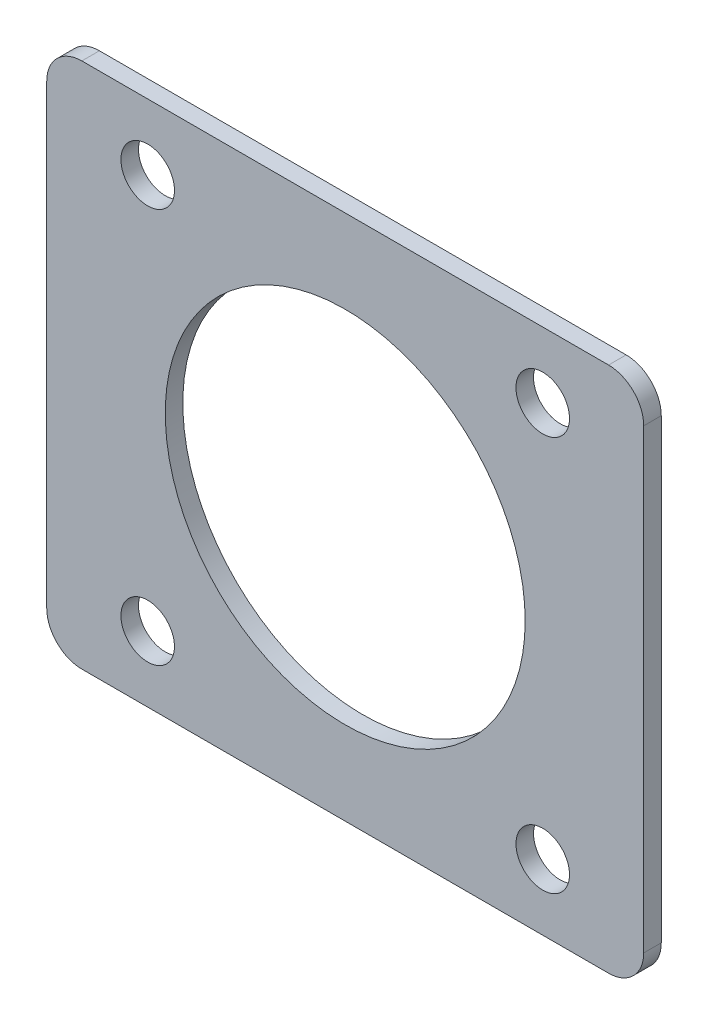
ISO-10303-21;
HEADER;
FILE_DESCRIPTION(('STEP AP214'),'2;1');
FILE_NAME('part.step','',(''),(''),'','','');
FILE_SCHEMA(('AUTOMOTIVE_DESIGN { 1 0 10303 214 1 1 1 1 }'));
ENDSEC;
DATA;
#1=APPLICATION_CONTEXT('core data for automotive mechanical design processes');
#2=APPLICATION_PROTOCOL_DEFINITION('international standard','automotive_design',2000,#1);
#3=PRODUCT_CONTEXT('',#1,'mechanical');
#4=PRODUCT('Part','Part','',(#3));
#5=PRODUCT_RELATED_PRODUCT_CATEGORY('part','',(#4));
#6=PRODUCT_DEFINITION_FORMATION('','',#4);
#7=PRODUCT_DEFINITION_CONTEXT('part definition',#1,'design');
#8=PRODUCT_DEFINITION('design','',#6,#7);
#9=PRODUCT_DEFINITION_SHAPE('','',#8);
#10=(LENGTH_UNIT() NAMED_UNIT(*) SI_UNIT(.MILLI.,.METRE.));
#11=(NAMED_UNIT(*) PLANE_ANGLE_UNIT() SI_UNIT($,.RADIAN.));
#12=(NAMED_UNIT(*) SI_UNIT($,.STERADIAN.) SOLID_ANGLE_UNIT());
#13=UNCERTAINTY_MEASURE_WITH_UNIT(LENGTH_MEASURE(1.E-05),#10,'distance_accuracy_value','');
#14=(GEOMETRIC_REPRESENTATION_CONTEXT(3) GLOBAL_UNCERTAINTY_ASSIGNED_CONTEXT((#13)) GLOBAL_UNIT_ASSIGNED_CONTEXT((#10,
#11,#12)) REPRESENTATION_CONTEXT('',''));
#15=CARTESIAN_POINT('',(0.,0.,0.));
#16=DIRECTION('',(0.,0.,1.));
#17=DIRECTION('',(1.,0.,0.));
#18=AXIS2_PLACEMENT_3D('',#15,#16,#17);
#19=CARTESIAN_POINT('',(30.,26.,2.));
#20=DIRECTION('',(0.,0.,1.));
#21=DIRECTION('',(1.,0.,0.));
#22=AXIS2_PLACEMENT_3D('',#19,#20,#21);
#23=PLANE('',#22);
#24=CARTESIAN_POINT('',(22.5,22.5,2.));
#25=DIRECTION('',(0.,0.,1.));
#26=DIRECTION('',(-1.,0.,0.));
#27=AXIS2_PLACEMENT_3D('',#24,#25,#26);
#28=CIRCLE('',#27,3.05);
#29=CARTESIAN_POINT('',(19.45,22.5,2.));
#30=VERTEX_POINT('',#29);
#31=EDGE_CURVE('E185',#30,#30,#28,.T.);
#32=ORIENTED_EDGE('',*,*,#31,.F.);
#33=EDGE_LOOP('',(#32));
#34=FACE_BOUND('',#33,.T.);
#35=CARTESIAN_POINT('',(-22.5,-22.5,2.));
#36=DIRECTION('',(0.,0.,1.));
#37=DIRECTION('',(-1.,0.,0.));
#38=AXIS2_PLACEMENT_3D('',#35,#36,#37);
#39=CIRCLE('',#38,3.05);
#40=CARTESIAN_POINT('',(-25.55,-22.5,2.));
#41=VERTEX_POINT('',#40);
#42=EDGE_CURVE('E186',#41,#41,#39,.T.);
#43=ORIENTED_EDGE('',*,*,#42,.F.);
#44=EDGE_LOOP('',(#43));
#45=FACE_BOUND('',#44,.T.);
#46=CARTESIAN_POINT('',(30.,26.,2.));
#47=DIRECTION('',(0.,0.,1.));
#48=DIRECTION('',(1.,0.,0.));
#49=AXIS2_PLACEMENT_3D('',#46,#47,#48);
#50=CIRCLE('',#49,4.);
#51=CARTESIAN_POINT('',(34.,26.,2.));
#52=VERTEX_POINT('',#51);
#53=CARTESIAN_POINT('',(30.,30.,2.));
#54=VERTEX_POINT('',#53);
#55=EDGE_CURVE('E199',#52,#54,#50,.T.);
#56=ORIENTED_EDGE('',*,*,#55,.T.);
#57=DIRECTION('',(-1.,0.,0.));
#58=VECTOR('',#57,1.);
#59=CARTESIAN_POINT('',(-30.,30.,2.));
#60=LINE('',#59,#58);
#61=CARTESIAN_POINT('',(-30.,30.,2.));
#62=VERTEX_POINT('',#61);
#63=EDGE_CURVE('E104',#54,#62,#60,.T.);
#64=ORIENTED_EDGE('',*,*,#63,.T.);
#65=CARTESIAN_POINT('',(-30.,26.,2.));
#66=DIRECTION('',(0.,0.,1.));
#67=DIRECTION('',(1.,0.,0.));
#68=AXIS2_PLACEMENT_3D('',#65,#66,#67);
#69=CIRCLE('',#68,4.);
#70=CARTESIAN_POINT('',(-34.,26.,2.));
#71=VERTEX_POINT('',#70);
#72=EDGE_CURVE('E210',#62,#71,#69,.T.);
#73=ORIENTED_EDGE('',*,*,#72,.T.);
#74=DIRECTION('',(0.,-1.,0.));
#75=VECTOR('',#74,1.);
#76=CARTESIAN_POINT('',(-34.,26.,2.));
#77=LINE('',#76,#75);
#78=CARTESIAN_POINT('',(-34.,-26.,2.));
#79=VERTEX_POINT('',#78);
#80=EDGE_CURVE('E213',#71,#79,#77,.T.);
#81=ORIENTED_EDGE('',*,*,#80,.T.);
#82=CARTESIAN_POINT('',(-30.,-26.,2.));
#83=DIRECTION('',(0.,0.,1.));
#84=DIRECTION('',(1.,0.,0.));
#85=AXIS2_PLACEMENT_3D('',#82,#83,#84);
#86=CIRCLE('',#85,4.);
#87=CARTESIAN_POINT('',(-30.,-30.,2.));
#88=VERTEX_POINT('',#87);
#89=EDGE_CURVE('E123',#79,#88,#86,.T.);
#90=ORIENTED_EDGE('',*,*,#89,.T.);
#91=DIRECTION('',(1.,0.,0.));
#92=VECTOR('',#91,1.);
#93=CARTESIAN_POINT('',(-30.,-30.,2.));
#94=LINE('',#93,#92);
#95=CARTESIAN_POINT('',(30.,-30.,2.));
#96=VERTEX_POINT('',#95);
#97=EDGE_CURVE('E117',#88,#96,#94,.T.);
#98=ORIENTED_EDGE('',*,*,#97,.T.);
#99=CARTESIAN_POINT('',(30.,-26.,2.));
#100=DIRECTION('',(0.,0.,1.));
#101=DIRECTION('',(1.,0.,0.));
#102=AXIS2_PLACEMENT_3D('',#99,#100,#101);
#103=CIRCLE('',#102,4.);
#104=CARTESIAN_POINT('',(34.,-26.,2.));
#105=VERTEX_POINT('',#104);
#106=EDGE_CURVE('E121',#96,#105,#103,.T.);
#107=ORIENTED_EDGE('',*,*,#106,.T.);
#108=DIRECTION('',(0.,1.,0.));
#109=VECTOR('',#108,1.);
#110=CARTESIAN_POINT('',(34.,26.,2.));
#111=LINE('',#110,#109);
#112=EDGE_CURVE('E61',#105,#52,#111,.T.);
#113=ORIENTED_EDGE('',*,*,#112,.T.);
#114=EDGE_LOOP('',(#56,#64,#73,#81,#90,#98,#107,#113));
#115=FACE_BOUND('',#114,.T.);
#116=CARTESIAN_POINT('',(22.5,-22.5,2.));
#117=DIRECTION('',(0.,0.,1.));
#118=DIRECTION('',(1.,0.,0.));
#119=AXIS2_PLACEMENT_3D('',#116,#117,#118);
#120=CIRCLE('',#119,3.05);
#121=CARTESIAN_POINT('',(25.55,-22.5,2.));
#122=VERTEX_POINT('',#121);
#123=EDGE_CURVE('E158',#122,#122,#120,.T.);
#124=ORIENTED_EDGE('',*,*,#123,.F.);
#125=EDGE_LOOP('',(#124));
#126=FACE_BOUND('',#125,.T.);
#127=CARTESIAN_POINT('',(-22.5,22.5,2.));
#128=DIRECTION('',(0.,0.,1.));
#129=DIRECTION('',(1.,0.,0.));
#130=AXIS2_PLACEMENT_3D('',#127,#128,#129);
#131=CIRCLE('',#130,3.05);
#132=CARTESIAN_POINT('',(-19.45,22.5,2.));
#133=VERTEX_POINT('',#132);
#134=EDGE_CURVE('E174',#133,#133,#131,.T.);
#135=ORIENTED_EDGE('',*,*,#134,.F.);
#136=EDGE_LOOP('',(#135));
#137=FACE_BOUND('',#136,.T.);
#138=CARTESIAN_POINT('',(0.,0.,2.));
#139=DIRECTION('',(0.,0.,1.));
#140=DIRECTION('',(1.,0.,0.));
#141=AXIS2_PLACEMENT_3D('',#138,#139,#140);
#142=CIRCLE('',#141,20.5);
#143=CARTESIAN_POINT('',(20.5,0.,2.));
#144=VERTEX_POINT('',#143);
#145=EDGE_CURVE('E270',#144,#144,#142,.T.);
#146=ORIENTED_EDGE('',*,*,#145,.F.);
#147=EDGE_LOOP('',(#146));
#148=FACE_BOUND('',#147,.T.);
#149=ADVANCED_FACE('F44',(#34,#45,#115,#126,#137,#148),#23,.T.);
#150=CARTESIAN_POINT('',(30.,26.,0.));
#151=DIRECTION('',(0.,0.,1.));
#152=DIRECTION('',(1.,0.,0.));
#153=AXIS2_PLACEMENT_3D('',#150,#151,#152);
#154=PLANE('',#153);
#155=CARTESIAN_POINT('',(30.,26.,0.));
#156=DIRECTION('',(0.,0.,1.));
#157=DIRECTION('',(1.,0.,0.));
#158=AXIS2_PLACEMENT_3D('',#155,#156,#157);
#159=CIRCLE('',#158,4.);
#160=CARTESIAN_POINT('',(34.,26.,0.));
#161=VERTEX_POINT('',#160);
#162=CARTESIAN_POINT('',(30.,30.,0.));
#163=VERTEX_POINT('',#162);
#164=EDGE_CURVE('E164',#161,#163,#159,.T.);
#165=ORIENTED_EDGE('',*,*,#164,.F.);
#166=DIRECTION('',(0.,1.,0.));
#167=VECTOR('',#166,1.);
#168=CARTESIAN_POINT('',(34.,26.,0.));
#169=LINE('',#168,#167);
#170=CARTESIAN_POINT('',(34.,-26.,0.));
#171=VERTEX_POINT('',#170);
#172=EDGE_CURVE('E96',#171,#161,#169,.T.);
#173=ORIENTED_EDGE('',*,*,#172,.F.);
#174=CARTESIAN_POINT('',(30.,-26.,0.));
#175=DIRECTION('',(0.,0.,1.));
#176=DIRECTION('',(1.,0.,0.));
#177=AXIS2_PLACEMENT_3D('',#174,#175,#176);
#178=CIRCLE('',#177,4.);
#179=CARTESIAN_POINT('',(30.,-30.,0.));
#180=VERTEX_POINT('',#179);
#181=EDGE_CURVE('E90',#180,#171,#178,.T.);
#182=ORIENTED_EDGE('',*,*,#181,.F.);
#183=DIRECTION('',(1.,0.,0.));
#184=VECTOR('',#183,1.);
#185=CARTESIAN_POINT('',(-30.,-30.,0.));
#186=LINE('',#185,#184);
#187=CARTESIAN_POINT('',(-30.,-30.,0.));
#188=VERTEX_POINT('',#187);
#189=EDGE_CURVE('E132',#188,#180,#186,.T.);
#190=ORIENTED_EDGE('',*,*,#189,.F.);
#191=CARTESIAN_POINT('',(-30.,-26.,0.));
#192=DIRECTION('',(0.,0.,1.));
#193=DIRECTION('',(1.,0.,0.));
#194=AXIS2_PLACEMENT_3D('',#191,#192,#193);
#195=CIRCLE('',#194,4.);
#196=CARTESIAN_POINT('',(-34.,-26.,0.));
#197=VERTEX_POINT('',#196);
#198=EDGE_CURVE('E237',#197,#188,#195,.T.);
#199=ORIENTED_EDGE('',*,*,#198,.F.);
#200=DIRECTION('',(0.,-1.,0.));
#201=VECTOR('',#200,1.);
#202=CARTESIAN_POINT('',(-34.,26.,0.));
#203=LINE('',#202,#201);
#204=CARTESIAN_POINT('',(-34.,26.,0.));
#205=VERTEX_POINT('',#204);
#206=EDGE_CURVE('E231',#205,#197,#203,.T.);
#207=ORIENTED_EDGE('',*,*,#206,.F.);
#208=CARTESIAN_POINT('',(-30.,26.,0.));
#209=DIRECTION('',(0.,0.,1.));
#210=DIRECTION('',(1.,0.,0.));
#211=AXIS2_PLACEMENT_3D('',#208,#209,#210);
#212=CIRCLE('',#211,4.);
#213=CARTESIAN_POINT('',(-30.,30.,0.));
#214=VERTEX_POINT('',#213);
#215=EDGE_CURVE('E245',#214,#205,#212,.T.);
#216=ORIENTED_EDGE('',*,*,#215,.F.);
#217=DIRECTION('',(-1.,0.,0.));
#218=VECTOR('',#217,1.);
#219=CARTESIAN_POINT('',(-30.,30.,0.));
#220=LINE('',#219,#218);
#221=EDGE_CURVE('E250',#163,#214,#220,.T.);
#222=ORIENTED_EDGE('',*,*,#221,.F.);
#223=EDGE_LOOP('',(#165,#173,#182,#190,#199,#207,#216,#222));
#224=FACE_BOUND('',#223,.T.);
#225=CARTESIAN_POINT('',(22.5,-22.5,0.));
#226=DIRECTION('',(0.,0.,1.));
#227=DIRECTION('',(1.,0.,0.));
#228=AXIS2_PLACEMENT_3D('',#225,#226,#227);
#229=CIRCLE('',#228,3.05);
#230=CARTESIAN_POINT('',(25.55,-22.5,0.));
#231=VERTEX_POINT('',#230);
#232=EDGE_CURVE('E165',#231,#231,#229,.T.);
#233=ORIENTED_EDGE('',*,*,#232,.T.);
#234=EDGE_LOOP('',(#233));
#235=FACE_BOUND('',#234,.T.);
#236=CARTESIAN_POINT('',(-22.5,-22.5,0.));
#237=DIRECTION('',(0.,0.,1.));
#238=DIRECTION('',(-1.,0.,0.));
#239=AXIS2_PLACEMENT_3D('',#236,#237,#238);
#240=CIRCLE('',#239,3.05);
#241=CARTESIAN_POINT('',(-25.55,-22.5,0.));
#242=VERTEX_POINT('',#241);
#243=EDGE_CURVE('E166',#242,#242,#240,.T.);
#244=ORIENTED_EDGE('',*,*,#243,.T.);
#245=EDGE_LOOP('',(#244));
#246=FACE_BOUND('',#245,.T.);
#247=CARTESIAN_POINT('',(-22.5,22.5,0.));
#248=DIRECTION('',(0.,0.,1.));
#249=DIRECTION('',(1.,0.,0.));
#250=AXIS2_PLACEMENT_3D('',#247,#248,#249);
#251=CIRCLE('',#250,3.05);
#252=CARTESIAN_POINT('',(-19.45,22.5,0.));
#253=VERTEX_POINT('',#252);
#254=EDGE_CURVE('E180',#253,#253,#251,.T.);
#255=ORIENTED_EDGE('',*,*,#254,.T.);
#256=EDGE_LOOP('',(#255));
#257=FACE_BOUND('',#256,.T.);
#258=CARTESIAN_POINT('',(22.5,22.5,0.));
#259=DIRECTION('',(0.,0.,1.));
#260=DIRECTION('',(-1.,0.,0.));
#261=AXIS2_PLACEMENT_3D('',#258,#259,#260);
#262=CIRCLE('',#261,3.05);
#263=CARTESIAN_POINT('',(19.45,22.5,0.));
#264=VERTEX_POINT('',#263);
#265=EDGE_CURVE('E181',#264,#264,#262,.T.);
#266=ORIENTED_EDGE('',*,*,#265,.T.);
#267=EDGE_LOOP('',(#266));
#268=FACE_BOUND('',#267,.T.);
#269=CARTESIAN_POINT('',(0.,0.,0.));
#270=DIRECTION('',(0.,0.,1.));
#271=DIRECTION('',(1.,0.,0.));
#272=AXIS2_PLACEMENT_3D('',#269,#270,#271);
#273=CIRCLE('',#272,20.5);
#274=CARTESIAN_POINT('',(20.5,0.,0.));
#275=VERTEX_POINT('',#274);
#276=EDGE_CURVE('E273',#275,#275,#273,.T.);
#277=ORIENTED_EDGE('',*,*,#276,.T.);
#278=EDGE_LOOP('',(#277));
#279=FACE_BOUND('',#278,.T.);
#280=ADVANCED_FACE('F248',(#224,#235,#246,#257,#268,#279),#154,.F.);
#281=CARTESIAN_POINT('',(30.,26.,2.));
#282=DIRECTION('',(0.,0.,-1.));
#283=DIRECTION('',(-1.,0.,0.));
#284=AXIS2_PLACEMENT_3D('',#281,#282,#283);
#285=CYLINDRICAL_SURFACE('',#284,4.);
#286=ORIENTED_EDGE('',*,*,#164,.T.);
#287=DIRECTION('',(0.,0.,-1.));
#288=VECTOR('',#287,1.);
#289=CARTESIAN_POINT('',(30.,30.,2.));
#290=LINE('',#289,#288);
#291=EDGE_CURVE('E12',#54,#163,#290,.T.);
#292=ORIENTED_EDGE('',*,*,#291,.F.);
#293=ORIENTED_EDGE('',*,*,#55,.F.);
#294=DIRECTION('',(0.,0.,-1.));
#295=VECTOR('',#294,1.);
#296=CARTESIAN_POINT('',(34.,26.,2.));
#297=LINE('',#296,#295);
#298=EDGE_CURVE('E140',#52,#161,#297,.T.);
#299=ORIENTED_EDGE('',*,*,#298,.T.);
#300=EDGE_LOOP('',(#286,#292,#293,#299));
#301=FACE_BOUND('',#300,.T.);
#302=ADVANCED_FACE('F46',(#301),#285,.T.);
#303=CARTESIAN_POINT('',(-30.,30.,2.));
#304=DIRECTION('',(0.,-1.,0.));
#305=DIRECTION('',(0.,0.,-1.));
#306=AXIS2_PLACEMENT_3D('',#303,#304,#305);
#307=PLANE('',#306);
#308=ORIENTED_EDGE('',*,*,#221,.T.);
#309=DIRECTION('',(0.,0.,-1.));
#310=VECTOR('',#309,1.);
#311=CARTESIAN_POINT('',(-30.,30.,2.));
#312=LINE('',#311,#310);
#313=EDGE_CURVE('E53',#62,#214,#312,.T.);
#314=ORIENTED_EDGE('',*,*,#313,.F.);
#315=ORIENTED_EDGE('',*,*,#63,.F.);
#316=ORIENTED_EDGE('',*,*,#291,.T.);
#317=EDGE_LOOP('',(#308,#314,#315,#316));
#318=FACE_BOUND('',#317,.T.);
#319=ADVANCED_FACE('F308',(#318),#307,.F.);
#320=CARTESIAN_POINT('',(-30.,26.,2.));
#321=DIRECTION('',(0.,0.,-1.));
#322=DIRECTION('',(-1.,0.,0.));
#323=AXIS2_PLACEMENT_3D('',#320,#321,#322);
#324=CYLINDRICAL_SURFACE('',#323,4.);
#325=ORIENTED_EDGE('',*,*,#215,.T.);
#326=DIRECTION('',(0.,0.,-1.));
#327=VECTOR('',#326,1.);
#328=CARTESIAN_POINT('',(-34.,26.,2.));
#329=LINE('',#328,#327);
#330=EDGE_CURVE('E234',#71,#205,#329,.T.);
#331=ORIENTED_EDGE('',*,*,#330,.F.);
#332=ORIENTED_EDGE('',*,*,#72,.F.);
#333=ORIENTED_EDGE('',*,*,#313,.T.);
#334=EDGE_LOOP('',(#325,#331,#332,#333));
#335=FACE_BOUND('',#334,.T.);
#336=ADVANCED_FACE('F244',(#335),#324,.T.);
#337=CARTESIAN_POINT('',(-34.,26.,2.));
#338=DIRECTION('',(1.,0.,0.));
#339=DIRECTION('',(0.,0.,-1.));
#340=AXIS2_PLACEMENT_3D('',#337,#338,#339);
#341=PLANE('',#340);
#342=ORIENTED_EDGE('',*,*,#206,.T.);
#343=DIRECTION('',(0.,0.,-1.));
#344=VECTOR('',#343,1.);
#345=CARTESIAN_POINT('',(-34.,-26.,2.));
#346=LINE('',#345,#344);
#347=EDGE_CURVE('E228',#79,#197,#346,.T.);
#348=ORIENTED_EDGE('',*,*,#347,.F.);
#349=ORIENTED_EDGE('',*,*,#80,.F.);
#350=ORIENTED_EDGE('',*,*,#330,.T.);
#351=EDGE_LOOP('',(#342,#348,#349,#350));
#352=FACE_BOUND('',#351,.T.);
#353=ADVANCED_FACE('F229',(#352),#341,.F.);
#354=CARTESIAN_POINT('',(-30.,-26.,2.));
#355=DIRECTION('',(0.,0.,-1.));
#356=DIRECTION('',(-1.,0.,0.));
#357=AXIS2_PLACEMENT_3D('',#354,#355,#356);
#358=CYLINDRICAL_SURFACE('',#357,4.);
#359=ORIENTED_EDGE('',*,*,#198,.T.);
#360=DIRECTION('',(0.,0.,-1.));
#361=VECTOR('',#360,1.);
#362=CARTESIAN_POINT('',(-30.,-30.,2.));
#363=LINE('',#362,#361);
#364=EDGE_CURVE('E133',#88,#188,#363,.T.);
#365=ORIENTED_EDGE('',*,*,#364,.F.);
#366=ORIENTED_EDGE('',*,*,#89,.F.);
#367=ORIENTED_EDGE('',*,*,#347,.T.);
#368=EDGE_LOOP('',(#359,#365,#366,#367));
#369=FACE_BOUND('',#368,.T.);
#370=ADVANCED_FACE('F236',(#369),#358,.T.);
#371=CARTESIAN_POINT('',(-30.,-30.,2.));
#372=DIRECTION('',(0.,1.,0.));
#373=DIRECTION('',(0.,0.,1.));
#374=AXIS2_PLACEMENT_3D('',#371,#372,#373);
#375=PLANE('',#374);
#376=ORIENTED_EDGE('',*,*,#189,.T.);
#377=DIRECTION('',(0.,0.,-1.));
#378=VECTOR('',#377,1.);
#379=CARTESIAN_POINT('',(30.,-30.,2.));
#380=LINE('',#379,#378);
#381=EDGE_CURVE('E129',#96,#180,#380,.T.);
#382=ORIENTED_EDGE('',*,*,#381,.F.);
#383=ORIENTED_EDGE('',*,*,#97,.F.);
#384=ORIENTED_EDGE('',*,*,#364,.T.);
#385=EDGE_LOOP('',(#376,#382,#383,#384));
#386=FACE_BOUND('',#385,.T.);
#387=ADVANCED_FACE('F130',(#386),#375,.F.);
#388=CARTESIAN_POINT('',(30.,-26.,2.));
#389=DIRECTION('',(0.,0.,-1.));
#390=DIRECTION('',(-1.,0.,0.));
#391=AXIS2_PLACEMENT_3D('',#388,#389,#390);
#392=CYLINDRICAL_SURFACE('',#391,4.);
#393=ORIENTED_EDGE('',*,*,#181,.T.);
#394=DIRECTION('',(0.,0.,-1.));
#395=VECTOR('',#394,1.);
#396=CARTESIAN_POINT('',(34.,-26.,2.));
#397=LINE('',#396,#395);
#398=EDGE_CURVE('E134',#105,#171,#397,.T.);
#399=ORIENTED_EDGE('',*,*,#398,.F.);
#400=ORIENTED_EDGE('',*,*,#106,.F.);
#401=ORIENTED_EDGE('',*,*,#381,.T.);
#402=EDGE_LOOP('',(#393,#399,#400,#401));
#403=FACE_BOUND('',#402,.T.);
#404=ADVANCED_FACE('F136',(#403),#392,.T.);
#405=CARTESIAN_POINT('',(34.,26.,2.));
#406=DIRECTION('',(-1.,0.,0.));
#407=DIRECTION('',(0.,-1.,0.));
#408=AXIS2_PLACEMENT_3D('',#405,#406,#407);
#409=PLANE('',#408);
#410=ORIENTED_EDGE('',*,*,#172,.T.);
#411=ORIENTED_EDGE('',*,*,#298,.F.);
#412=ORIENTED_EDGE('',*,*,#112,.F.);
#413=ORIENTED_EDGE('',*,*,#398,.T.);
#414=EDGE_LOOP('',(#410,#411,#412,#413));
#415=FACE_BOUND('',#414,.T.);
#416=ADVANCED_FACE('F259',(#415),#409,.F.);
#417=CARTESIAN_POINT('',(22.5,-22.5,2.));
#418=DIRECTION('',(0.,0.,-1.));
#419=DIRECTION('',(-1.,0.,0.));
#420=AXIS2_PLACEMENT_3D('',#417,#418,#419);
#421=CYLINDRICAL_SURFACE('',#420,3.05);
#422=ORIENTED_EDGE('',*,*,#123,.T.);
#423=EDGE_LOOP('',(#422));
#424=FACE_BOUND('',#423,.T.);
#425=ORIENTED_EDGE('',*,*,#232,.F.);
#426=EDGE_LOOP('',(#425));
#427=FACE_BOUND('',#426,.T.);
#428=ADVANCED_FACE('F294',(#424,#427),#421,.F.);
#429=CARTESIAN_POINT('',(-22.5,-22.5,2.));
#430=DIRECTION('',(0.,0.,-1.));
#431=DIRECTION('',(-1.,0.,0.));
#432=AXIS2_PLACEMENT_3D('',#429,#430,#431);
#433=CYLINDRICAL_SURFACE('',#432,3.05);
#434=ORIENTED_EDGE('',*,*,#42,.T.);
#435=EDGE_LOOP('',(#434));
#436=FACE_BOUND('',#435,.T.);
#437=ORIENTED_EDGE('',*,*,#243,.F.);
#438=EDGE_LOOP('',(#437));
#439=FACE_BOUND('',#438,.T.);
#440=ADVANCED_FACE('F368',(#436,#439),#433,.F.);
#441=CARTESIAN_POINT('',(-22.5,22.5,2.));
#442=DIRECTION('',(0.,0.,-1.));
#443=DIRECTION('',(-1.,0.,0.));
#444=AXIS2_PLACEMENT_3D('',#441,#442,#443);
#445=CYLINDRICAL_SURFACE('',#444,3.05);
#446=ORIENTED_EDGE('',*,*,#134,.T.);
#447=EDGE_LOOP('',(#446));
#448=FACE_BOUND('',#447,.T.);
#449=ORIENTED_EDGE('',*,*,#254,.F.);
#450=EDGE_LOOP('',(#449));
#451=FACE_BOUND('',#450,.T.);
#452=ADVANCED_FACE('F376',(#448,#451),#445,.F.);
#453=CARTESIAN_POINT('',(22.5,22.5,2.));
#454=DIRECTION('',(0.,0.,-1.));
#455=DIRECTION('',(-1.,0.,0.));
#456=AXIS2_PLACEMENT_3D('',#453,#454,#455);
#457=CYLINDRICAL_SURFACE('',#456,3.05);
#458=ORIENTED_EDGE('',*,*,#31,.T.);
#459=EDGE_LOOP('',(#458));
#460=FACE_BOUND('',#459,.T.);
#461=ORIENTED_EDGE('',*,*,#265,.F.);
#462=EDGE_LOOP('',(#461));
#463=FACE_BOUND('',#462,.T.);
#464=ADVANCED_FACE('F384',(#460,#463),#457,.F.);
#465=CARTESIAN_POINT('',(0.,0.,2.));
#466=DIRECTION('',(0.,0.,-1.));
#467=DIRECTION('',(-1.,0.,0.));
#468=AXIS2_PLACEMENT_3D('',#465,#466,#467);
#469=CYLINDRICAL_SURFACE('',#468,20.5);
#470=ORIENTED_EDGE('',*,*,#145,.T.);
#471=EDGE_LOOP('',(#470));
#472=FACE_BOUND('',#471,.T.);
#473=ORIENTED_EDGE('',*,*,#276,.F.);
#474=EDGE_LOOP('',(#473));
#475=FACE_BOUND('',#474,.T.);
#476=ADVANCED_FACE('F282',(#472,#475),#469,.F.);
#477=CLOSED_SHELL('',(#149,#280,#302,#319,#336,#353,#370,#387,#404,#416,#428,#440,#452,#464,#476));
#478=MANIFOLD_SOLID_BREP('B2',#477);
#479=ADVANCED_BREP_SHAPE_REPRESENTATION('',(#18,#478),#14);
#480=SHAPE_DEFINITION_REPRESENTATION(#9,#479);
ENDSEC;
END-ISO-10303-21;
